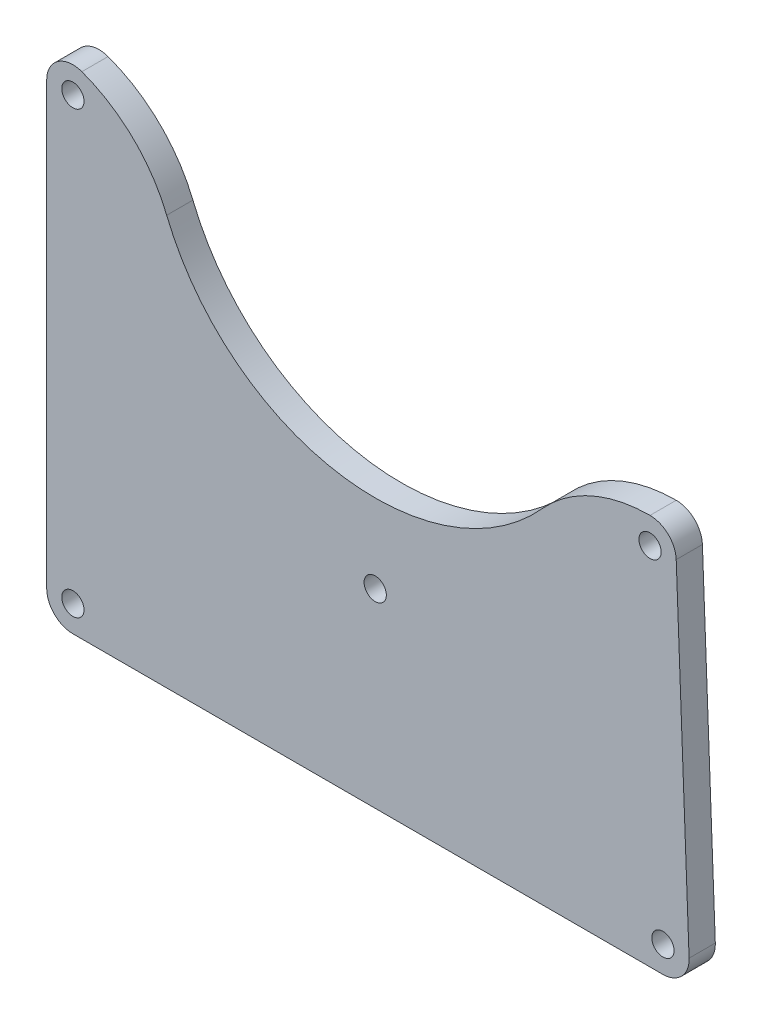
ISO-10303-21;
HEADER;
FILE_DESCRIPTION(('STEP AP214'),'2;1');
FILE_NAME('part.step','',(''),(''),'','','');
FILE_SCHEMA(('AUTOMOTIVE_DESIGN { 1 0 10303 214 1 1 1 1 }'));
ENDSEC;
DATA;
#1=APPLICATION_CONTEXT('core data for automotive mechanical design processes');
#2=APPLICATION_PROTOCOL_DEFINITION('international standard','automotive_design',2000,#1);
#3=PRODUCT_CONTEXT('',#1,'mechanical');
#4=PRODUCT('Part','Part','',(#3));
#5=PRODUCT_RELATED_PRODUCT_CATEGORY('part','',(#4));
#6=PRODUCT_DEFINITION_FORMATION('','',#4);
#7=PRODUCT_DEFINITION_CONTEXT('part definition',#1,'design');
#8=PRODUCT_DEFINITION('design','',#6,#7);
#9=PRODUCT_DEFINITION_SHAPE('','',#8);
#10=(LENGTH_UNIT() NAMED_UNIT(*) SI_UNIT(.MILLI.,.METRE.));
#11=(NAMED_UNIT(*) PLANE_ANGLE_UNIT() SI_UNIT($,.RADIAN.));
#12=(NAMED_UNIT(*) SI_UNIT($,.STERADIAN.) SOLID_ANGLE_UNIT());
#13=UNCERTAINTY_MEASURE_WITH_UNIT(LENGTH_MEASURE(1.E-05),#10,'distance_accuracy_value','');
#14=(GEOMETRIC_REPRESENTATION_CONTEXT(3) GLOBAL_UNCERTAINTY_ASSIGNED_CONTEXT((#13)) GLOBAL_UNIT_ASSIGNED_CONTEXT((#10,
#11,#12)) REPRESENTATION_CONTEXT('',''));
#15=CARTESIAN_POINT('',(0.,0.,0.));
#16=DIRECTION('',(0.,0.,1.));
#17=DIRECTION('',(1.,0.,0.));
#18=AXIS2_PLACEMENT_3D('',#15,#16,#17);
#19=CARTESIAN_POINT('',(-78.5286385602361,-31.7516717105644,91.));
#20=DIRECTION('',(0.,0.,1.));
#21=DIRECTION('',(1.,0.,0.));
#22=AXIS2_PLACEMENT_3D('',#19,#20,#21);
#23=PLANE('',#22);
#24=CARTESIAN_POINT('',(-69.2240235522653,-6.18745207944441,91.));
#25=DIRECTION('',(0.,0.,1.));
#26=DIRECTION('',(1.,0.,0.));
#27=AXIS2_PLACEMENT_3D('',#24,#25,#26);
#28=CIRCLE('',#27,2.54999999999999);
#29=CARTESIAN_POINT('',(-66.6740235522653,-6.18745207944441,91.));
#30=VERTEX_POINT('',#29);
#31=EDGE_CURVE('E224',#30,#30,#28,.T.);
#32=ORIENTED_EDGE('',*,*,#31,.F.);
#33=EDGE_LOOP('',(#32));
#34=FACE_BOUND('',#33,.T.);
#35=CARTESIAN_POINT('',(65.8833493638774,-107.050315411693,91.));
#36=DIRECTION('',(0.,0.,1.));
#37=DIRECTION('',(1.,0.,0.));
#38=AXIS2_PLACEMENT_3D('',#35,#36,#37);
#39=CIRCLE('',#38,2.54999999999997);
#40=CARTESIAN_POINT('',(68.4333493638774,-107.050315411693,91.));
#41=VERTEX_POINT('',#40);
#42=EDGE_CURVE('E212',#41,#41,#39,.T.);
#43=ORIENTED_EDGE('',*,*,#42,.F.);
#44=EDGE_LOOP('',(#43));
#45=FACE_BOUND('',#44,.T.);
#46=CARTESIAN_POINT('',(-78.5286385602361,-31.7516717105644,91.));
#47=DIRECTION('',(0.,0.,1.));
#48=DIRECTION('',(1.,0.,0.));
#49=AXIS2_PLACEMENT_3D('',#46,#47,#48);
#50=CIRCLE('',#49,33.2048743021301);
#51=CARTESIAN_POINT('',(-47.7448897619161,-19.304805143344,91.));
#52=VERTEX_POINT('',#51);
#53=CARTESIAN_POINT('',(-67.1719026923114,-0.549296354728918,91.));
#54=VERTEX_POINT('',#53);
#55=EDGE_CURVE('E161',#52,#54,#50,.T.);
#56=ORIENTED_EDGE('',*,*,#55,.T.);
#57=CARTESIAN_POINT('',(-69.2240235522653,-6.18745207944441,91.));
#58=DIRECTION('',(0.,0.,1.));
#59=DIRECTION('',(1.,0.,0.));
#60=AXIS2_PLACEMENT_3D('',#57,#58,#59);
#61=CIRCLE('',#60,6.);
#62=CARTESIAN_POINT('',(-75.2240235522653,-6.18745207944441,91.));
#63=VERTEX_POINT('',#62);
#64=EDGE_CURVE('E99',#54,#63,#61,.T.);
#65=ORIENTED_EDGE('',*,*,#64,.T.);
#66=DIRECTION('',(0.,-1.,0.));
#67=VECTOR('',#66,1.);
#68=CARTESIAN_POINT('',(-75.2240235522653,-6.18745207944441,91.));
#69=LINE('',#68,#67);
#70=CARTESIAN_POINT('',(-75.2240235522653,-107.050315411693,91.));
#71=VERTEX_POINT('',#70);
#72=EDGE_CURVE('E182',#63,#71,#69,.T.);
#73=ORIENTED_EDGE('',*,*,#72,.T.);
#74=CARTESIAN_POINT('',(-69.2240235522653,-107.050315411693,91.));
#75=DIRECTION('',(0.,0.,1.));
#76=DIRECTION('',(1.,0.,0.));
#77=AXIS2_PLACEMENT_3D('',#74,#75,#76);
#78=CIRCLE('',#77,6.00000000000001);
#79=CARTESIAN_POINT('',(-69.2240235522653,-113.050315411693,91.));
#80=VERTEX_POINT('',#79);
#81=EDGE_CURVE('E201',#71,#80,#78,.T.);
#82=ORIENTED_EDGE('',*,*,#81,.T.);
#83=DIRECTION('',(1.,0.,0.));
#84=VECTOR('',#83,1.);
#85=CARTESIAN_POINT('',(-69.2240235522653,-113.050315411693,91.));
#86=LINE('',#85,#84);
#87=CARTESIAN_POINT('',(65.8833493638774,-113.050315411693,91.));
#88=VERTEX_POINT('',#87);
#89=EDGE_CURVE('E198',#80,#88,#86,.T.);
#90=ORIENTED_EDGE('',*,*,#89,.T.);
#91=CARTESIAN_POINT('',(65.8833493638774,-107.050315411693,91.));
#92=DIRECTION('',(0.,0.,1.));
#93=DIRECTION('',(1.,0.,0.));
#94=AXIS2_PLACEMENT_3D('',#91,#92,#93);
#95=CIRCLE('',#94,5.99999999999999);
#96=CARTESIAN_POINT('',(71.879013250047,-106.822248395048,91.));
#97=VERTEX_POINT('',#96);
#98=EDGE_CURVE('E200',#88,#97,#95,.T.);
#99=ORIENTED_EDGE('',*,*,#98,.T.);
#100=DIRECTION('',(-0.0380111694408644,0.999277314361603,0.));
#101=VECTOR('',#100,1.);
#102=CARTESIAN_POINT('',(71.879013250047,-106.822248395048,91.));
#103=LINE('',#102,#101);
#104=CARTESIAN_POINT('',(68.9287347523114,-29.2622465007995,91.));
#105=VERTEX_POINT('',#104);
#106=EDGE_CURVE('E124',#97,#105,#103,.T.);
#107=ORIENTED_EDGE('',*,*,#106,.T.);
#108=CARTESIAN_POINT('',(62.9330708661417,-29.4903135174447,91.));
#109=DIRECTION('',(0.,0.,1.));
#110=DIRECTION('',(1.,0.,0.));
#111=AXIS2_PLACEMENT_3D('',#108,#109,#110);
#112=CIRCLE('',#111,5.99999999999999);
#113=CARTESIAN_POINT('',(62.9330708661417,-23.4903135174447,91.));
#114=VERTEX_POINT('',#113);
#115=EDGE_CURVE('E118',#105,#114,#112,.T.);
#116=ORIENTED_EDGE('',*,*,#115,.T.);
#117=CARTESIAN_POINT('',(62.9330708661415,-56.6951878195749,91.));
#118=DIRECTION('',(0.,0.,1.));
#119=DIRECTION('',(1.,0.,0.));
#120=AXIS2_PLACEMENT_3D('',#117,#118,#119);
#121=CIRCLE('',#120,33.2048743021301);
#122=CARTESIAN_POINT('',(38.262888367509,-34.4702969783485,91.));
#123=VERTEX_POINT('',#122);
#124=EDGE_CURVE('E122',#114,#123,#121,.T.);
#125=ORIENTED_EDGE('',*,*,#124,.T.);
#126=CARTESIAN_POINT('',(0.,0.,91.));
#127=DIRECTION('',(0.,0.,-1.));
#128=DIRECTION('',(1.,0.,0.));
#129=AXIS2_PLACEMENT_3D('',#126,#127,#128);
#130=CIRCLE('',#129,51.5);
#131=EDGE_CURVE('E50',#123,#52,#130,.T.);
#132=ORIENTED_EDGE('',*,*,#131,.T.);
#133=EDGE_LOOP('',(#56,#65,#73,#82,#90,#99,#107,#116,#125,#132));
#134=FACE_BOUND('',#133,.T.);
#135=CARTESIAN_POINT('',(62.9330708661417,-29.4903135174447,91.));
#136=DIRECTION('',(0.,0.,1.));
#137=DIRECTION('',(1.,0.,0.));
#138=AXIS2_PLACEMENT_3D('',#135,#136,#137);
#139=CIRCLE('',#138,2.54999999999999);
#140=CARTESIAN_POINT('',(65.4830708661417,-29.4903135174447,91.));
#141=VERTEX_POINT('',#140);
#142=EDGE_CURVE('E146',#141,#141,#139,.T.);
#143=ORIENTED_EDGE('',*,*,#142,.F.);
#144=EDGE_LOOP('',(#143));
#145=FACE_BOUND('',#144,.T.);
#146=CARTESIAN_POINT('',(-69.2240235522653,-107.050315411693,91.));
#147=DIRECTION('',(0.,0.,1.));
#148=DIRECTION('',(1.,0.,0.));
#149=AXIS2_PLACEMENT_3D('',#146,#147,#148);
#150=CIRCLE('',#149,2.54999999999999);
#151=CARTESIAN_POINT('',(-66.6740235522653,-107.050315411693,91.));
#152=VERTEX_POINT('',#151);
#153=EDGE_CURVE('E218',#152,#152,#150,.T.);
#154=ORIENTED_EDGE('',*,*,#153,.F.);
#155=EDGE_LOOP('',(#154));
#156=FACE_BOUND('',#155,.T.);
#157=CARTESIAN_POINT('',(0.,-69.5,91.));
#158=DIRECTION('',(0.,0.,1.));
#159=DIRECTION('',(1.,0.,0.));
#160=AXIS2_PLACEMENT_3D('',#157,#158,#159);
#161=CIRCLE('',#160,2.54999999999999);
#162=CARTESIAN_POINT('',(2.54999999999999,-69.5,91.));
#163=VERTEX_POINT('',#162);
#164=EDGE_CURVE('E230',#163,#163,#161,.T.);
#165=ORIENTED_EDGE('',*,*,#164,.F.);
#166=EDGE_LOOP('',(#165));
#167=FACE_BOUND('',#166,.T.);
#168=ADVANCED_FACE('F33',(#34,#45,#134,#145,#156,#167),#23,.T.);
#169=CARTESIAN_POINT('',(-78.5286385602361,-31.7516717105644,85.));
#170=DIRECTION('',(0.,0.,1.));
#171=DIRECTION('',(1.,0.,0.));
#172=AXIS2_PLACEMENT_3D('',#169,#170,#171);
#173=PLANE('',#172);
#174=CARTESIAN_POINT('',(-78.5286385602361,-31.7516717105644,85.));
#175=DIRECTION('',(0.,0.,1.));
#176=DIRECTION('',(1.,0.,0.));
#177=AXIS2_PLACEMENT_3D('',#174,#175,#176);
#178=CIRCLE('',#177,33.2048743021301);
#179=CARTESIAN_POINT('',(-47.7448897619161,-19.304805143344,85.));
#180=VERTEX_POINT('',#179);
#181=CARTESIAN_POINT('',(-67.1719026923114,-0.549296354728918,85.));
#182=VERTEX_POINT('',#181);
#183=EDGE_CURVE('E142',#180,#182,#178,.T.);
#184=ORIENTED_EDGE('',*,*,#183,.F.);
#185=CARTESIAN_POINT('',(0.,0.,85.));
#186=DIRECTION('',(0.,0.,-1.));
#187=DIRECTION('',(1.,0.,0.));
#188=AXIS2_PLACEMENT_3D('',#185,#186,#187);
#189=CIRCLE('',#188,51.5);
#190=CARTESIAN_POINT('',(38.262888367509,-34.4702969783485,85.));
#191=VERTEX_POINT('',#190);
#192=EDGE_CURVE('E91',#191,#180,#189,.T.);
#193=ORIENTED_EDGE('',*,*,#192,.F.);
#194=CARTESIAN_POINT('',(62.9330708661415,-56.6951878195749,85.));
#195=DIRECTION('',(0.,0.,1.));
#196=DIRECTION('',(1.,0.,0.));
#197=AXIS2_PLACEMENT_3D('',#194,#195,#196);
#198=CIRCLE('',#197,33.2048743021301);
#199=CARTESIAN_POINT('',(62.9330708661417,-23.4903135174447,85.));
#200=VERTEX_POINT('',#199);
#201=EDGE_CURVE('E85',#200,#191,#198,.T.);
#202=ORIENTED_EDGE('',*,*,#201,.F.);
#203=CARTESIAN_POINT('',(62.9330708661417,-29.4903135174447,85.));
#204=DIRECTION('',(0.,0.,1.));
#205=DIRECTION('',(1.,0.,0.));
#206=AXIS2_PLACEMENT_3D('',#203,#204,#205);
#207=CIRCLE('',#206,5.99999999999999);
#208=CARTESIAN_POINT('',(68.9287347523114,-29.2622465007995,85.));
#209=VERTEX_POINT('',#208);
#210=EDGE_CURVE('E132',#209,#200,#207,.T.);
#211=ORIENTED_EDGE('',*,*,#210,.F.);
#212=DIRECTION('',(-0.0380111694408644,0.999277314361603,0.));
#213=VECTOR('',#212,1.);
#214=CARTESIAN_POINT('',(71.879013250047,-106.822248395048,85.));
#215=LINE('',#214,#213);
#216=CARTESIAN_POINT('',(71.879013250047,-106.822248395048,85.));
#217=VERTEX_POINT('',#216);
#218=EDGE_CURVE('E156',#217,#209,#215,.T.);
#219=ORIENTED_EDGE('',*,*,#218,.F.);
#220=CARTESIAN_POINT('',(65.8833493638774,-107.050315411693,85.));
#221=DIRECTION('',(0.,0.,1.));
#222=DIRECTION('',(1.,0.,0.));
#223=AXIS2_PLACEMENT_3D('',#220,#221,#222);
#224=CIRCLE('',#223,5.99999999999999);
#225=CARTESIAN_POINT('',(65.8833493638774,-113.050315411693,85.));
#226=VERTEX_POINT('',#225);
#227=EDGE_CURVE('E154',#226,#217,#224,.T.);
#228=ORIENTED_EDGE('',*,*,#227,.F.);
#229=DIRECTION('',(1.,0.,0.));
#230=VECTOR('',#229,1.);
#231=CARTESIAN_POINT('',(-69.2240235522653,-113.050315411693,85.));
#232=LINE('',#231,#230);
#233=CARTESIAN_POINT('',(-69.2240235522653,-113.050315411693,85.));
#234=VERTEX_POINT('',#233);
#235=EDGE_CURVE('E152',#234,#226,#232,.T.);
#236=ORIENTED_EDGE('',*,*,#235,.F.);
#237=CARTESIAN_POINT('',(-69.2240235522653,-107.050315411693,85.));
#238=DIRECTION('',(0.,0.,1.));
#239=DIRECTION('',(1.,0.,0.));
#240=AXIS2_PLACEMENT_3D('',#237,#238,#239);
#241=CIRCLE('',#240,6.00000000000001);
#242=CARTESIAN_POINT('',(-75.2240235522653,-107.050315411693,85.));
#243=VERTEX_POINT('',#242);
#244=EDGE_CURVE('E150',#243,#234,#241,.T.);
#245=ORIENTED_EDGE('',*,*,#244,.F.);
#246=DIRECTION('',(0.,-1.,0.));
#247=VECTOR('',#246,1.);
#248=CARTESIAN_POINT('',(-75.2240235522653,-6.18745207944441,85.));
#249=LINE('',#248,#247);
#250=CARTESIAN_POINT('',(-75.2240235522653,-6.18745207944441,85.));
#251=VERTEX_POINT('',#250);
#252=EDGE_CURVE('E148',#251,#243,#249,.T.);
#253=ORIENTED_EDGE('',*,*,#252,.F.);
#254=CARTESIAN_POINT('',(-69.2240235522653,-6.18745207944441,85.));
#255=DIRECTION('',(0.,0.,1.));
#256=DIRECTION('',(1.,0.,0.));
#257=AXIS2_PLACEMENT_3D('',#254,#255,#256);
#258=CIRCLE('',#257,6.);
#259=EDGE_CURVE('E145',#182,#251,#258,.T.);
#260=ORIENTED_EDGE('',*,*,#259,.F.);
#261=EDGE_LOOP('',(#184,#193,#202,#211,#219,#228,#236,#245,#253,#260));
#262=FACE_BOUND('',#261,.T.);
#263=CARTESIAN_POINT('',(62.9330708661417,-29.4903135174447,85.));
#264=DIRECTION('',(0.,0.,1.));
#265=DIRECTION('',(1.,0.,0.));
#266=AXIS2_PLACEMENT_3D('',#263,#264,#265);
#267=CIRCLE('',#266,2.54999999999999);
#268=CARTESIAN_POINT('',(65.4830708661417,-29.4903135174447,85.));
#269=VERTEX_POINT('',#268);
#270=EDGE_CURVE('E209',#269,#269,#267,.T.);
#271=ORIENTED_EDGE('',*,*,#270,.T.);
#272=EDGE_LOOP('',(#271));
#273=FACE_BOUND('',#272,.T.);
#274=CARTESIAN_POINT('',(65.8833493638774,-107.050315411693,85.));
#275=DIRECTION('',(0.,0.,1.));
#276=DIRECTION('',(1.,0.,0.));
#277=AXIS2_PLACEMENT_3D('',#274,#275,#276);
#278=CIRCLE('',#277,2.54999999999997);
#279=CARTESIAN_POINT('',(68.4333493638774,-107.050315411693,85.));
#280=VERTEX_POINT('',#279);
#281=EDGE_CURVE('E215',#280,#280,#278,.T.);
#282=ORIENTED_EDGE('',*,*,#281,.T.);
#283=EDGE_LOOP('',(#282));
#284=FACE_BOUND('',#283,.T.);
#285=CARTESIAN_POINT('',(-69.2240235522653,-107.050315411693,85.));
#286=DIRECTION('',(0.,0.,1.));
#287=DIRECTION('',(1.,0.,0.));
#288=AXIS2_PLACEMENT_3D('',#285,#286,#287);
#289=CIRCLE('',#288,2.54999999999999);
#290=CARTESIAN_POINT('',(-66.6740235522653,-107.050315411693,85.));
#291=VERTEX_POINT('',#290);
#292=EDGE_CURVE('E221',#291,#291,#289,.T.);
#293=ORIENTED_EDGE('',*,*,#292,.T.);
#294=EDGE_LOOP('',(#293));
#295=FACE_BOUND('',#294,.T.);
#296=CARTESIAN_POINT('',(-69.2240235522653,-6.18745207944441,85.));
#297=DIRECTION('',(0.,0.,1.));
#298=DIRECTION('',(1.,0.,0.));
#299=AXIS2_PLACEMENT_3D('',#296,#297,#298);
#300=CIRCLE('',#299,2.54999999999999);
#301=CARTESIAN_POINT('',(-66.6740235522653,-6.18745207944441,85.));
#302=VERTEX_POINT('',#301);
#303=EDGE_CURVE('E227',#302,#302,#300,.T.);
#304=ORIENTED_EDGE('',*,*,#303,.T.);
#305=EDGE_LOOP('',(#304));
#306=FACE_BOUND('',#305,.T.);
#307=CARTESIAN_POINT('',(0.,-69.5,85.));
#308=DIRECTION('',(0.,0.,1.));
#309=DIRECTION('',(1.,0.,0.));
#310=AXIS2_PLACEMENT_3D('',#307,#308,#309);
#311=CIRCLE('',#310,2.54999999999999);
#312=CARTESIAN_POINT('',(2.54999999999999,-69.5,85.));
#313=VERTEX_POINT('',#312);
#314=EDGE_CURVE('E233',#313,#313,#311,.T.);
#315=ORIENTED_EDGE('',*,*,#314,.T.);
#316=EDGE_LOOP('',(#315));
#317=FACE_BOUND('',#316,.T.);
#318=ADVANCED_FACE('F186',(#262,#273,#284,#295,#306,#317),#173,.F.);
#319=CARTESIAN_POINT('',(-78.5286385602361,-31.7516717105644,91.));
#320=DIRECTION('',(0.,0.,-1.));
#321=DIRECTION('',(-1.,0.,0.));
#322=AXIS2_PLACEMENT_3D('',#319,#320,#321);
#323=CYLINDRICAL_SURFACE('',#322,33.2048743021301);
#324=ORIENTED_EDGE('',*,*,#183,.T.);
#325=DIRECTION('',(0.,0.,-1.));
#326=VECTOR('',#325,1.);
#327=CARTESIAN_POINT('',(-67.1719026923114,-0.549296354728918,91.));
#328=LINE('',#327,#326);
#329=EDGE_CURVE('E11',#54,#182,#328,.T.);
#330=ORIENTED_EDGE('',*,*,#329,.F.);
#331=ORIENTED_EDGE('',*,*,#55,.F.);
#332=DIRECTION('',(0.,0.,-1.));
#333=VECTOR('',#332,1.);
#334=CARTESIAN_POINT('',(-47.7448897619161,-19.304805143344,91.));
#335=LINE('',#334,#333);
#336=EDGE_CURVE('E138',#52,#180,#335,.T.);
#337=ORIENTED_EDGE('',*,*,#336,.T.);
#338=EDGE_LOOP('',(#324,#330,#331,#337));
#339=FACE_BOUND('',#338,.T.);
#340=ADVANCED_FACE('F35',(#339),#323,.T.);
#341=CARTESIAN_POINT('',(-69.2240235522653,-6.18745207944441,91.));
#342=DIRECTION('',(0.,0.,-1.));
#343=DIRECTION('',(-1.,0.,0.));
#344=AXIS2_PLACEMENT_3D('',#341,#342,#343);
#345=CYLINDRICAL_SURFACE('',#344,6.);
#346=ORIENTED_EDGE('',*,*,#259,.T.);
#347=DIRECTION('',(0.,0.,-1.));
#348=VECTOR('',#347,1.);
#349=CARTESIAN_POINT('',(-75.2240235522653,-6.18745207944441,91.));
#350=LINE('',#349,#348);
#351=EDGE_CURVE('E42',#63,#251,#350,.T.);
#352=ORIENTED_EDGE('',*,*,#351,.F.);
#353=ORIENTED_EDGE('',*,*,#64,.F.);
#354=ORIENTED_EDGE('',*,*,#329,.T.);
#355=EDGE_LOOP('',(#346,#352,#353,#354));
#356=FACE_BOUND('',#355,.T.);
#357=ADVANCED_FACE('F275',(#356),#345,.T.);
#358=CARTESIAN_POINT('',(-75.2240235522653,-6.18745207944441,91.));
#359=DIRECTION('',(1.,0.,0.));
#360=DIRECTION('',(0.,1.,0.));
#361=AXIS2_PLACEMENT_3D('',#358,#359,#360);
#362=PLANE('',#361);
#363=ORIENTED_EDGE('',*,*,#252,.T.);
#364=DIRECTION('',(0.,0.,-1.));
#365=VECTOR('',#364,1.);
#366=CARTESIAN_POINT('',(-75.2240235522653,-107.050315411693,91.));
#367=LINE('',#366,#365);
#368=EDGE_CURVE('E174',#71,#243,#367,.T.);
#369=ORIENTED_EDGE('',*,*,#368,.F.);
#370=ORIENTED_EDGE('',*,*,#72,.F.);
#371=ORIENTED_EDGE('',*,*,#351,.T.);
#372=EDGE_LOOP('',(#363,#369,#370,#371));
#373=FACE_BOUND('',#372,.T.);
#374=ADVANCED_FACE('F180',(#373),#362,.F.);
#375=CARTESIAN_POINT('',(-69.2240235522653,-107.050315411693,91.));
#376=DIRECTION('',(0.,0.,-1.));
#377=DIRECTION('',(-1.,0.,0.));
#378=AXIS2_PLACEMENT_3D('',#375,#376,#377);
#379=CYLINDRICAL_SURFACE('',#378,6.00000000000001);
#380=ORIENTED_EDGE('',*,*,#244,.T.);
#381=DIRECTION('',(0.,0.,-1.));
#382=VECTOR('',#381,1.);
#383=CARTESIAN_POINT('',(-69.2240235522653,-113.050315411693,91.));
#384=LINE('',#383,#382);
#385=EDGE_CURVE('E171',#80,#234,#384,.T.);
#386=ORIENTED_EDGE('',*,*,#385,.F.);
#387=ORIENTED_EDGE('',*,*,#81,.F.);
#388=ORIENTED_EDGE('',*,*,#368,.T.);
#389=EDGE_LOOP('',(#380,#386,#387,#388));
#390=FACE_BOUND('',#389,.T.);
#391=ADVANCED_FACE('F192',(#390),#379,.T.);
#392=CARTESIAN_POINT('',(-69.2240235522653,-113.050315411693,91.));
#393=DIRECTION('',(0.,1.,0.));
#394=DIRECTION('',(-1.,0.,0.));
#395=AXIS2_PLACEMENT_3D('',#392,#393,#394);
#396=PLANE('',#395);
#397=ORIENTED_EDGE('',*,*,#235,.T.);
#398=DIRECTION('',(0.,0.,-1.));
#399=VECTOR('',#398,1.);
#400=CARTESIAN_POINT('',(65.8833493638774,-113.050315411693,91.));
#401=LINE('',#400,#399);
#402=EDGE_CURVE('E168',#88,#226,#401,.T.);
#403=ORIENTED_EDGE('',*,*,#402,.F.);
#404=ORIENTED_EDGE('',*,*,#89,.F.);
#405=ORIENTED_EDGE('',*,*,#385,.T.);
#406=EDGE_LOOP('',(#397,#403,#404,#405));
#407=FACE_BOUND('',#406,.T.);
#408=ADVANCED_FACE('F196',(#407),#396,.F.);
#409=CARTESIAN_POINT('',(65.8833493638774,-107.050315411693,91.));
#410=DIRECTION('',(0.,0.,-1.));
#411=DIRECTION('',(-1.,0.,0.));
#412=AXIS2_PLACEMENT_3D('',#409,#410,#411);
#413=CYLINDRICAL_SURFACE('',#412,5.99999999999999);
#414=ORIENTED_EDGE('',*,*,#227,.T.);
#415=DIRECTION('',(0.,0.,-1.));
#416=VECTOR('',#415,1.);
#417=CARTESIAN_POINT('',(71.879013250047,-106.822248395048,91.));
#418=LINE('',#417,#416);
#419=EDGE_CURVE('E165',#97,#217,#418,.T.);
#420=ORIENTED_EDGE('',*,*,#419,.F.);
#421=ORIENTED_EDGE('',*,*,#98,.F.);
#422=ORIENTED_EDGE('',*,*,#402,.T.);
#423=EDGE_LOOP('',(#414,#420,#421,#422));
#424=FACE_BOUND('',#423,.T.);
#425=ADVANCED_FACE('F265',(#424),#413,.T.);
#426=CARTESIAN_POINT('',(71.879013250047,-106.822248395048,91.));
#427=DIRECTION('',(-0.999277314361603,-0.0380111694408644,0.));
#428=DIRECTION('',(0.0380111694408644,-0.999277314361603,0.));
#429=AXIS2_PLACEMENT_3D('',#426,#427,#428);
#430=PLANE('',#429);
#431=ORIENTED_EDGE('',*,*,#218,.T.);
#432=DIRECTION('',(0.,0.,-1.));
#433=VECTOR('',#432,1.);
#434=CARTESIAN_POINT('',(68.9287347523114,-29.2622465007995,91.));
#435=LINE('',#434,#433);
#436=EDGE_CURVE('E133',#105,#209,#435,.T.);
#437=ORIENTED_EDGE('',*,*,#436,.F.);
#438=ORIENTED_EDGE('',*,*,#106,.F.);
#439=ORIENTED_EDGE('',*,*,#419,.T.);
#440=EDGE_LOOP('',(#431,#437,#438,#439));
#441=FACE_BOUND('',#440,.T.);
#442=ADVANCED_FACE('F262',(#441),#430,.F.);
#443=CARTESIAN_POINT('',(62.9330708661417,-29.4903135174447,91.));
#444=DIRECTION('',(0.,0.,-1.));
#445=DIRECTION('',(-1.,0.,0.));
#446=AXIS2_PLACEMENT_3D('',#443,#444,#445);
#447=CYLINDRICAL_SURFACE('',#446,5.99999999999999);
#448=ORIENTED_EDGE('',*,*,#210,.T.);
#449=DIRECTION('',(0.,0.,-1.));
#450=VECTOR('',#449,1.);
#451=CARTESIAN_POINT('',(62.9330708661417,-23.4903135174447,91.));
#452=LINE('',#451,#450);
#453=EDGE_CURVE('E129',#114,#200,#452,.T.);
#454=ORIENTED_EDGE('',*,*,#453,.F.);
#455=ORIENTED_EDGE('',*,*,#115,.F.);
#456=ORIENTED_EDGE('',*,*,#436,.T.);
#457=EDGE_LOOP('',(#448,#454,#455,#456));
#458=FACE_BOUND('',#457,.T.);
#459=ADVANCED_FACE('F130',(#458),#447,.T.);
#460=CARTESIAN_POINT('',(62.9330708661415,-56.6951878195749,91.));
#461=DIRECTION('',(0.,0.,-1.));
#462=DIRECTION('',(-1.,0.,0.));
#463=AXIS2_PLACEMENT_3D('',#460,#461,#462);
#464=CYLINDRICAL_SURFACE('',#463,33.2048743021301);
#465=ORIENTED_EDGE('',*,*,#201,.T.);
#466=DIRECTION('',(0.,0.,-1.));
#467=VECTOR('',#466,1.);
#468=CARTESIAN_POINT('',(38.262888367509,-34.4702969783485,91.));
#469=LINE('',#468,#467);
#470=EDGE_CURVE('E134',#123,#191,#469,.T.);
#471=ORIENTED_EDGE('',*,*,#470,.F.);
#472=ORIENTED_EDGE('',*,*,#124,.F.);
#473=ORIENTED_EDGE('',*,*,#453,.T.);
#474=EDGE_LOOP('',(#465,#471,#472,#473));
#475=FACE_BOUND('',#474,.T.);
#476=ADVANCED_FACE('F136',(#475),#464,.T.);
#477=CARTESIAN_POINT('',(0.,0.,91.));
#478=DIRECTION('',(0.,0.,-1.));
#479=DIRECTION('',(-1.,0.,0.));
#480=AXIS2_PLACEMENT_3D('',#477,#478,#479);
#481=CYLINDRICAL_SURFACE('',#480,51.5);
#482=ORIENTED_EDGE('',*,*,#192,.T.);
#483=ORIENTED_EDGE('',*,*,#336,.F.);
#484=ORIENTED_EDGE('',*,*,#131,.F.);
#485=ORIENTED_EDGE('',*,*,#470,.T.);
#486=EDGE_LOOP('',(#482,#483,#484,#485));
#487=FACE_BOUND('',#486,.T.);
#488=ADVANCED_FACE('F255',(#487),#481,.F.);
#489=CARTESIAN_POINT('',(62.9330708661417,-29.4903135174447,91.));
#490=DIRECTION('',(0.,0.,-1.));
#491=DIRECTION('',(-1.,0.,0.));
#492=AXIS2_PLACEMENT_3D('',#489,#490,#491);
#493=CYLINDRICAL_SURFACE('',#492,2.54999999999999);
#494=ORIENTED_EDGE('',*,*,#142,.T.);
#495=EDGE_LOOP('',(#494));
#496=FACE_BOUND('',#495,.T.);
#497=ORIENTED_EDGE('',*,*,#270,.F.);
#498=EDGE_LOOP('',(#497));
#499=FACE_BOUND('',#498,.T.);
#500=ADVANCED_FACE('F252',(#496,#499),#493,.F.);
#501=CARTESIAN_POINT('',(65.8833493638774,-107.050315411693,91.));
#502=DIRECTION('',(0.,0.,-1.));
#503=DIRECTION('',(-1.,0.,0.));
#504=AXIS2_PLACEMENT_3D('',#501,#502,#503);
#505=CYLINDRICAL_SURFACE('',#504,2.54999999999997);
#506=ORIENTED_EDGE('',*,*,#42,.T.);
#507=EDGE_LOOP('',(#506));
#508=FACE_BOUND('',#507,.T.);
#509=ORIENTED_EDGE('',*,*,#281,.F.);
#510=EDGE_LOOP('',(#509));
#511=FACE_BOUND('',#510,.T.);
#512=ADVANCED_FACE('F351',(#508,#511),#505,.F.);
#513=CARTESIAN_POINT('',(-69.2240235522653,-107.050315411693,91.));
#514=DIRECTION('',(0.,0.,-1.));
#515=DIRECTION('',(-1.,0.,0.));
#516=AXIS2_PLACEMENT_3D('',#513,#514,#515);
#517=CYLINDRICAL_SURFACE('',#516,2.54999999999999);
#518=ORIENTED_EDGE('',*,*,#153,.T.);
#519=EDGE_LOOP('',(#518));
#520=FACE_BOUND('',#519,.T.);
#521=ORIENTED_EDGE('',*,*,#292,.F.);
#522=EDGE_LOOP('',(#521));
#523=FACE_BOUND('',#522,.T.);
#524=ADVANCED_FACE('F359',(#520,#523),#517,.F.);
#525=CARTESIAN_POINT('',(-69.2240235522653,-6.18745207944441,91.));
#526=DIRECTION('',(0.,0.,-1.));
#527=DIRECTION('',(-1.,0.,0.));
#528=AXIS2_PLACEMENT_3D('',#525,#526,#527);
#529=CYLINDRICAL_SURFACE('',#528,2.54999999999999);
#530=ORIENTED_EDGE('',*,*,#31,.T.);
#531=EDGE_LOOP('',(#530));
#532=FACE_BOUND('',#531,.T.);
#533=ORIENTED_EDGE('',*,*,#303,.F.);
#534=EDGE_LOOP('',(#533));
#535=FACE_BOUND('',#534,.T.);
#536=ADVANCED_FACE('F367',(#532,#535),#529,.F.);
#537=CARTESIAN_POINT('',(0.,-69.5,91.));
#538=DIRECTION('',(0.,0.,-1.));
#539=DIRECTION('',(-1.,0.,0.));
#540=AXIS2_PLACEMENT_3D('',#537,#538,#539);
#541=CYLINDRICAL_SURFACE('',#540,2.54999999999999);
#542=ORIENTED_EDGE('',*,*,#164,.T.);
#543=EDGE_LOOP('',(#542));
#544=FACE_BOUND('',#543,.T.);
#545=ORIENTED_EDGE('',*,*,#314,.F.);
#546=EDGE_LOOP('',(#545));
#547=FACE_BOUND('',#546,.T.);
#548=ADVANCED_FACE('F239',(#544,#547),#541,.F.);
#549=CLOSED_SHELL('',(#168,#318,#340,#357,#374,#391,#408,#425,#442,#459,#476,#488,#500,#512,
#524,#536,#548));
#550=MANIFOLD_SOLID_BREP('B2',#549);
#551=ADVANCED_BREP_SHAPE_REPRESENTATION('',(#18,#550),#14);
#552=SHAPE_DEFINITION_REPRESENTATION(#9,#551);
ENDSEC;
END-ISO-10303-21;
